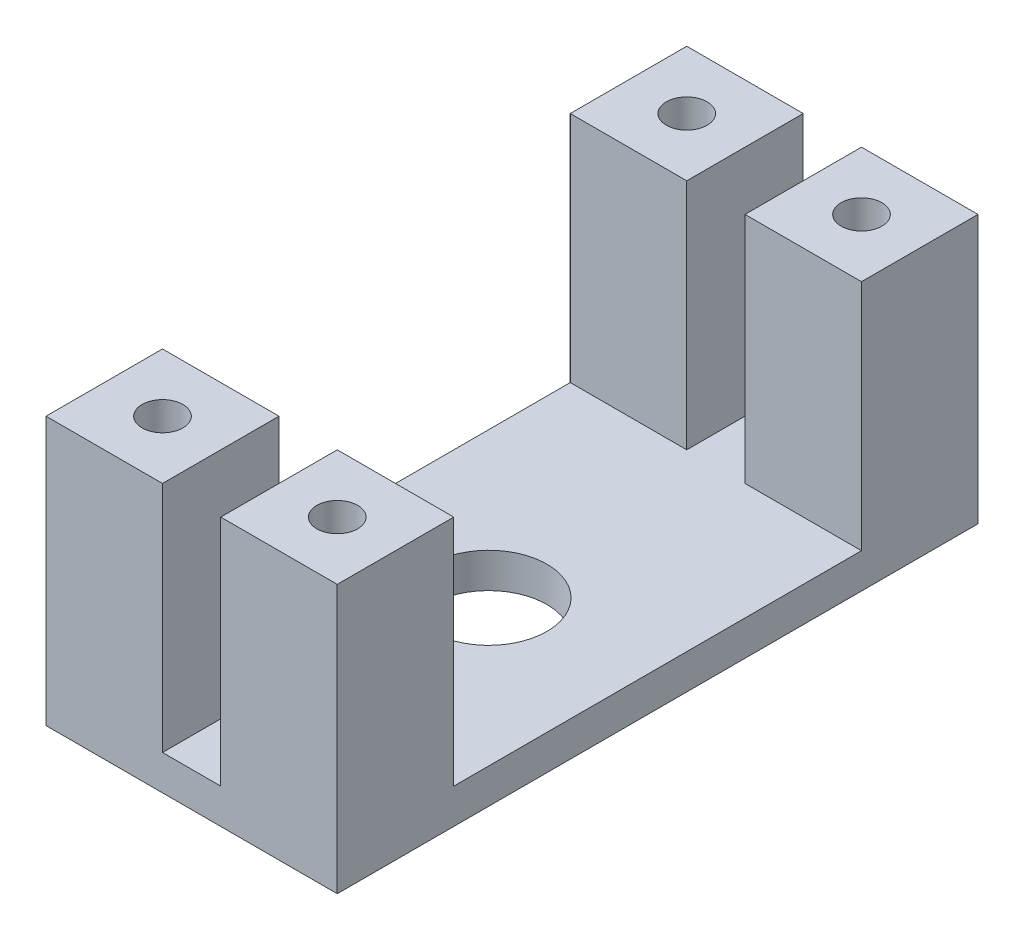
ISO-10303-21;
HEADER;
FILE_DESCRIPTION(('STEP AP214'),'2;1');
FILE_NAME('part.step','',(''),(''),'','','');
FILE_SCHEMA(('AUTOMOTIVE_DESIGN { 1 0 10303 214 1 1 1 1 }'));
ENDSEC;
DATA;
#1=APPLICATION_CONTEXT('core data for automotive mechanical design processes');
#2=APPLICATION_PROTOCOL_DEFINITION('international standard','automotive_design',2000,#1);
#3=PRODUCT_CONTEXT('',#1,'mechanical');
#4=PRODUCT('Part','Part','',(#3));
#5=PRODUCT_RELATED_PRODUCT_CATEGORY('part','',(#4));
#6=PRODUCT_DEFINITION_FORMATION('','',#4);
#7=PRODUCT_DEFINITION_CONTEXT('part definition',#1,'design');
#8=PRODUCT_DEFINITION('design','',#6,#7);
#9=PRODUCT_DEFINITION_SHAPE('','',#8);
#10=(LENGTH_UNIT() NAMED_UNIT(*) SI_UNIT(.MILLI.,.METRE.));
#11=(NAMED_UNIT(*) PLANE_ANGLE_UNIT() SI_UNIT($,.RADIAN.));
#12=(NAMED_UNIT(*) SI_UNIT($,.STERADIAN.) SOLID_ANGLE_UNIT());
#13=UNCERTAINTY_MEASURE_WITH_UNIT(LENGTH_MEASURE(1.E-05),#10,'distance_accuracy_value','');
#14=(GEOMETRIC_REPRESENTATION_CONTEXT(3) GLOBAL_UNCERTAINTY_ASSIGNED_CONTEXT((#13)) GLOBAL_UNIT_ASSIGNED_CONTEXT((#10,
#11,#12)) REPRESENTATION_CONTEXT('',''));
#15=CARTESIAN_POINT('',(0.,0.,0.));
#16=DIRECTION('',(0.,0.,1.));
#17=DIRECTION('',(1.,0.,0.));
#18=AXIS2_PLACEMENT_3D('',#15,#16,#17);
#19=CARTESIAN_POINT('',(0.,23.,0.));
#20=DIRECTION('',(0.,1.,0.));
#21=DIRECTION('',(0.,0.,1.));
#22=AXIS2_PLACEMENT_3D('',#19,#20,#21);
#23=PLANE('',#22);
#24=DIRECTION('',(0.,0.,1.));
#25=VECTOR('',#24,1.);
#26=CARTESIAN_POINT('',(2.5,23.,-27.5));
#27=LINE('',#26,#25);
#28=CARTESIAN_POINT('',(2.5,23.,-27.5));
#29=VERTEX_POINT('',#28);
#30=CARTESIAN_POINT('',(2.5,23.,-17.5));
#31=VERTEX_POINT('',#30);
#32=EDGE_CURVE('E227',#29,#31,#27,.T.);
#33=ORIENTED_EDGE('',*,*,#32,.T.);
#34=DIRECTION('',(1.,0.,0.));
#35=VECTOR('',#34,1.);
#36=CARTESIAN_POINT('',(2.5,23.,-17.5));
#37=LINE('',#36,#35);
#38=CARTESIAN_POINT('',(12.5,23.,-17.5));
#39=VERTEX_POINT('',#38);
#40=EDGE_CURVE('E235',#31,#39,#37,.T.);
#41=ORIENTED_EDGE('',*,*,#40,.T.);
#42=DIRECTION('',(0.,0.,-1.));
#43=VECTOR('',#42,1.);
#44=CARTESIAN_POINT('',(12.5,23.,-27.5));
#45=LINE('',#44,#43);
#46=CARTESIAN_POINT('',(12.5,23.,-27.5));
#47=VERTEX_POINT('',#46);
#48=EDGE_CURVE('E232',#39,#47,#45,.T.);
#49=ORIENTED_EDGE('',*,*,#48,.T.);
#50=DIRECTION('',(-1.,0.,0.));
#51=VECTOR('',#50,1.);
#52=CARTESIAN_POINT('',(2.5,23.,-27.5));
#53=LINE('',#52,#51);
#54=EDGE_CURVE('E222',#47,#29,#53,.T.);
#55=ORIENTED_EDGE('',*,*,#54,.T.);
#56=EDGE_LOOP('',(#33,#41,#49,#55));
#57=FACE_BOUND('',#56,.T.);
#58=CARTESIAN_POINT('',(7.5,23.,-22.5));
#59=DIRECTION('',(0.,-1.,0.));
#60=DIRECTION('',(0.,0.,-1.));
#61=AXIS2_PLACEMENT_3D('',#58,#59,#60);
#62=CIRCLE('',#61,1.75000000000001);
#63=CARTESIAN_POINT('',(7.5,23.,-24.25));
#64=VERTEX_POINT('',#63);
#65=EDGE_CURVE('E408',#64,#64,#62,.T.);
#66=ORIENTED_EDGE('',*,*,#65,.T.);
#67=EDGE_LOOP('',(#66));
#68=FACE_BOUND('',#67,.T.);
#69=ADVANCED_FACE('F38',(#57,#68),#23,.T.);
#70=CARTESIAN_POINT('',(0.,3.,0.));
#71=DIRECTION('',(0.,1.,0.));
#72=DIRECTION('',(0.,0.,1.));
#73=AXIS2_PLACEMENT_3D('',#70,#71,#72);
#74=PLANE('',#73);
#75=CARTESIAN_POINT('',(0.,3.,2.));
#76=DIRECTION('',(0.,1.,0.));
#77=DIRECTION('',(0.,0.,1.));
#78=AXIS2_PLACEMENT_3D('',#75,#76,#77);
#79=CIRCLE('',#78,5.00000000000001);
#80=CARTESIAN_POINT('',(0.,3.,7.00000000000001));
#81=VERTEX_POINT('',#80);
#82=EDGE_CURVE('E177',#81,#81,#79,.T.);
#83=ORIENTED_EDGE('',*,*,#82,.F.);
#84=EDGE_LOOP('',(#83));
#85=FACE_BOUND('',#84,.T.);
#86=DIRECTION('',(-1.,0.,0.));
#87=VECTOR('',#86,1.);
#88=CARTESIAN_POINT('',(-12.5,3.,17.5));
#89=LINE('',#88,#87);
#90=CARTESIAN_POINT('',(-2.49999999999999,3.,17.5));
#91=VERTEX_POINT('',#90);
#92=CARTESIAN_POINT('',(-12.5,3.,17.5));
#93=VERTEX_POINT('',#92);
#94=EDGE_CURVE('E53',#91,#93,#89,.T.);
#95=ORIENTED_EDGE('',*,*,#94,.F.);
#96=DIRECTION('',(0.,0.,-1.));
#97=VECTOR('',#96,1.);
#98=CARTESIAN_POINT('',(-2.49999999999999,3.,27.5));
#99=LINE('',#98,#97);
#100=CARTESIAN_POINT('',(-2.49999999999999,3.,27.5));
#101=VERTEX_POINT('',#100);
#102=EDGE_CURVE('E162',#101,#91,#99,.T.);
#103=ORIENTED_EDGE('',*,*,#102,.F.);
#104=DIRECTION('',(1.,0.,0.));
#105=VECTOR('',#104,1.);
#106=CARTESIAN_POINT('',(-12.5,3.,27.5));
#107=LINE('',#106,#105);
#108=CARTESIAN_POINT('',(2.50000000000001,3.,27.5));
#109=VERTEX_POINT('',#108);
#110=EDGE_CURVE('E150',#101,#109,#107,.T.);
#111=ORIENTED_EDGE('',*,*,#110,.T.);
#112=DIRECTION('',(0.,0.,1.));
#113=VECTOR('',#112,1.);
#114=CARTESIAN_POINT('',(2.50000000000001,3.,27.5));
#115=LINE('',#114,#113);
#116=CARTESIAN_POINT('',(2.50000000000001,3.,17.5));
#117=VERTEX_POINT('',#116);
#118=EDGE_CURVE('E199',#117,#109,#115,.T.);
#119=ORIENTED_EDGE('',*,*,#118,.F.);
#120=DIRECTION('',(-1.,0.,0.));
#121=VECTOR('',#120,1.);
#122=CARTESIAN_POINT('',(12.5,3.,17.5));
#123=LINE('',#122,#121);
#124=CARTESIAN_POINT('',(12.5,3.,17.5));
#125=VERTEX_POINT('',#124);
#126=EDGE_CURVE('E201',#125,#117,#123,.T.);
#127=ORIENTED_EDGE('',*,*,#126,.F.);
#128=DIRECTION('',(0.,0.,-1.));
#129=VECTOR('',#128,1.);
#130=CARTESIAN_POINT('',(12.5,3.,-27.5));
#131=LINE('',#130,#129);
#132=CARTESIAN_POINT('',(12.5,3.,-17.5));
#133=VERTEX_POINT('',#132);
#134=EDGE_CURVE('E264',#125,#133,#131,.T.);
#135=ORIENTED_EDGE('',*,*,#134,.T.);
#136=DIRECTION('',(1.,0.,0.));
#137=VECTOR('',#136,1.);
#138=CARTESIAN_POINT('',(2.5,3.,-17.5));
#139=LINE('',#138,#137);
#140=CARTESIAN_POINT('',(2.5,3.,-17.5));
#141=VERTEX_POINT('',#140);
#142=EDGE_CURVE('E223',#141,#133,#139,.T.);
#143=ORIENTED_EDGE('',*,*,#142,.F.);
#144=DIRECTION('',(0.,0.,1.));
#145=VECTOR('',#144,1.);
#146=CARTESIAN_POINT('',(2.5,3.,-27.5));
#147=LINE('',#146,#145);
#148=CARTESIAN_POINT('',(2.5,3.,-27.5));
#149=VERTEX_POINT('',#148);
#150=EDGE_CURVE('E226',#149,#141,#147,.T.);
#151=ORIENTED_EDGE('',*,*,#150,.F.);
#152=DIRECTION('',(-1.,0.,0.));
#153=VECTOR('',#152,1.);
#154=CARTESIAN_POINT('',(-12.5,3.,-27.5));
#155=LINE('',#154,#153);
#156=CARTESIAN_POINT('',(-2.5,3.,-27.5));
#157=VERTEX_POINT('',#156);
#158=EDGE_CURVE('E266',#149,#157,#155,.T.);
#159=ORIENTED_EDGE('',*,*,#158,.T.);
#160=DIRECTION('',(0.,0.,-1.));
#161=VECTOR('',#160,1.);
#162=CARTESIAN_POINT('',(-2.5,3.,-27.5));
#163=LINE('',#162,#161);
#164=CARTESIAN_POINT('',(-2.5,3.,-17.5));
#165=VERTEX_POINT('',#164);
#166=EDGE_CURVE('E243',#165,#157,#163,.T.);
#167=ORIENTED_EDGE('',*,*,#166,.F.);
#168=DIRECTION('',(1.,0.,0.));
#169=VECTOR('',#168,1.);
#170=CARTESIAN_POINT('',(-12.5,3.,-17.5));
#171=LINE('',#170,#169);
#172=CARTESIAN_POINT('',(-12.5,3.,-17.5));
#173=VERTEX_POINT('',#172);
#174=EDGE_CURVE('E230',#173,#165,#171,.T.);
#175=ORIENTED_EDGE('',*,*,#174,.F.);
#176=DIRECTION('',(0.,0.,1.));
#177=VECTOR('',#176,1.);
#178=CARTESIAN_POINT('',(-12.5,3.,-27.5));
#179=LINE('',#178,#177);
#180=EDGE_CURVE('E58',#173,#93,#179,.T.);
#181=ORIENTED_EDGE('',*,*,#180,.T.);
#182=EDGE_LOOP('',(#95,#103,#111,#119,#127,#135,#143,#151,#159,#167,#175,#181));
#183=FACE_BOUND('',#182,.T.);
#184=ADVANCED_FACE('F163',(#85,#183),#74,.T.);
#185=CARTESIAN_POINT('',(12.5,3.,-27.5));
#186=DIRECTION('',(-1.,0.,0.));
#187=DIRECTION('',(0.,0.,1.));
#188=AXIS2_PLACEMENT_3D('',#185,#186,#187);
#189=PLANE('',#188);
#190=DIRECTION('',(0.,0.,-1.));
#191=VECTOR('',#190,1.);
#192=CARTESIAN_POINT('',(12.5,0.,-27.5));
#193=LINE('',#192,#191);
#194=CARTESIAN_POINT('',(12.5,0.,27.5));
#195=VERTEX_POINT('',#194);
#196=CARTESIAN_POINT('',(12.5,0.,-27.5));
#197=VERTEX_POINT('',#196);
#198=EDGE_CURVE('E263',#195,#197,#193,.T.);
#199=ORIENTED_EDGE('',*,*,#198,.T.);
#200=DIRECTION('',(0.,-1.,0.));
#201=VECTOR('',#200,1.);
#202=CARTESIAN_POINT('',(12.5,3.,-27.5));
#203=LINE('',#202,#201);
#204=EDGE_CURVE('E11',#47,#197,#203,.T.);
#205=ORIENTED_EDGE('',*,*,#204,.F.);
#206=ORIENTED_EDGE('',*,*,#48,.F.);
#207=DIRECTION('',(0.,-1.,0.));
#208=VECTOR('',#207,1.);
#209=CARTESIAN_POINT('',(12.5,23.,-17.5));
#210=LINE('',#209,#208);
#211=EDGE_CURVE('E216',#39,#133,#210,.T.);
#212=ORIENTED_EDGE('',*,*,#211,.T.);
#213=ORIENTED_EDGE('',*,*,#134,.F.);
#214=DIRECTION('',(0.,-1.,0.));
#215=VECTOR('',#214,1.);
#216=CARTESIAN_POINT('',(12.5,23.,17.5));
#217=LINE('',#216,#215);
#218=CARTESIAN_POINT('',(12.5,23.,17.5));
#219=VERTEX_POINT('',#218);
#220=EDGE_CURVE('E167',#219,#125,#217,.T.);
#221=ORIENTED_EDGE('',*,*,#220,.F.);
#222=DIRECTION('',(0.,0.,-1.));
#223=VECTOR('',#222,1.);
#224=CARTESIAN_POINT('',(12.5,23.,27.5));
#225=LINE('',#224,#223);
#226=CARTESIAN_POINT('',(12.5,23.,27.5));
#227=VERTEX_POINT('',#226);
#228=EDGE_CURVE('E202',#227,#219,#225,.T.);
#229=ORIENTED_EDGE('',*,*,#228,.F.);
#230=DIRECTION('',(0.,-1.,0.));
#231=VECTOR('',#230,1.);
#232=CARTESIAN_POINT('',(12.5,3.,27.5));
#233=LINE('',#232,#231);
#234=EDGE_CURVE('E160',#227,#195,#233,.T.);
#235=ORIENTED_EDGE('',*,*,#234,.T.);
#236=EDGE_LOOP('',(#199,#205,#206,#212,#213,#221,#229,#235));
#237=FACE_BOUND('',#236,.T.);
#238=ADVANCED_FACE('F40',(#237),#189,.F.);
#239=CARTESIAN_POINT('',(-12.5,3.,-27.5));
#240=DIRECTION('',(0.,0.,1.));
#241=DIRECTION('',(1.,0.,0.));
#242=AXIS2_PLACEMENT_3D('',#239,#240,#241);
#243=PLANE('',#242);
#244=DIRECTION('',(-1.,0.,0.));
#245=VECTOR('',#244,1.);
#246=CARTESIAN_POINT('',(-12.5,0.,-27.5));
#247=LINE('',#246,#245);
#248=CARTESIAN_POINT('',(-12.5,0.,-27.5));
#249=VERTEX_POINT('',#248);
#250=EDGE_CURVE('E272',#197,#249,#247,.T.);
#251=ORIENTED_EDGE('',*,*,#250,.T.);
#252=DIRECTION('',(0.,-1.,0.));
#253=VECTOR('',#252,1.);
#254=CARTESIAN_POINT('',(-12.5,3.,-27.5));
#255=LINE('',#254,#253);
#256=CARTESIAN_POINT('',(-12.5,23.,-27.5));
#257=VERTEX_POINT('',#256);
#258=EDGE_CURVE('E46',#257,#249,#255,.T.);
#259=ORIENTED_EDGE('',*,*,#258,.F.);
#260=DIRECTION('',(-1.,0.,0.));
#261=VECTOR('',#260,1.);
#262=CARTESIAN_POINT('',(-12.5,23.,-27.5));
#263=LINE('',#262,#261);
#264=CARTESIAN_POINT('',(-2.5,23.,-27.5));
#265=VERTEX_POINT('',#264);
#266=EDGE_CURVE('E247',#265,#257,#263,.T.);
#267=ORIENTED_EDGE('',*,*,#266,.F.);
#268=DIRECTION('',(0.,-1.,0.));
#269=VECTOR('',#268,1.);
#270=CARTESIAN_POINT('',(-2.5,23.,-27.5));
#271=LINE('',#270,#269);
#272=EDGE_CURVE('E250',#265,#157,#271,.T.);
#273=ORIENTED_EDGE('',*,*,#272,.T.);
#274=ORIENTED_EDGE('',*,*,#158,.F.);
#275=DIRECTION('',(0.,-1.,0.));
#276=VECTOR('',#275,1.);
#277=CARTESIAN_POINT('',(2.5,23.,-27.5));
#278=LINE('',#277,#276);
#279=EDGE_CURVE('E219',#29,#149,#278,.T.);
#280=ORIENTED_EDGE('',*,*,#279,.F.);
#281=ORIENTED_EDGE('',*,*,#54,.F.);
#282=ORIENTED_EDGE('',*,*,#204,.T.);
#283=EDGE_LOOP('',(#251,#259,#267,#273,#274,#280,#281,#282));
#284=FACE_BOUND('',#283,.T.);
#285=ADVANCED_FACE('F346',(#284),#243,.F.);
#286=CARTESIAN_POINT('',(-12.5,3.,-27.5));
#287=DIRECTION('',(1.,0.,0.));
#288=DIRECTION('',(0.,0.,-1.));
#289=AXIS2_PLACEMENT_3D('',#286,#287,#288);
#290=PLANE('',#289);
#291=DIRECTION('',(0.,0.,1.));
#292=VECTOR('',#291,1.);
#293=CARTESIAN_POINT('',(-12.5,0.,-27.5));
#294=LINE('',#293,#292);
#295=CARTESIAN_POINT('',(-12.5,0.,27.5));
#296=VERTEX_POINT('',#295);
#297=EDGE_CURVE('E274',#249,#296,#294,.T.);
#298=ORIENTED_EDGE('',*,*,#297,.T.);
#299=DIRECTION('',(0.,-1.,0.));
#300=VECTOR('',#299,1.);
#301=CARTESIAN_POINT('',(-12.5,3.,27.5));
#302=LINE('',#301,#300);
#303=CARTESIAN_POINT('',(-12.5,23.,27.5));
#304=VERTEX_POINT('',#303);
#305=EDGE_CURVE('E279',#304,#296,#302,.T.);
#306=ORIENTED_EDGE('',*,*,#305,.F.);
#307=DIRECTION('',(0.,0.,1.));
#308=VECTOR('',#307,1.);
#309=CARTESIAN_POINT('',(-12.5,23.,27.5));
#310=LINE('',#309,#308);
#311=CARTESIAN_POINT('',(-12.5,23.,17.5));
#312=VERTEX_POINT('',#311);
#313=EDGE_CURVE('E184',#312,#304,#310,.T.);
#314=ORIENTED_EDGE('',*,*,#313,.F.);
#315=DIRECTION('',(0.,-1.,0.));
#316=VECTOR('',#315,1.);
#317=CARTESIAN_POINT('',(-12.5,23.,17.5));
#318=LINE('',#317,#316);
#319=EDGE_CURVE('E174',#312,#93,#318,.T.);
#320=ORIENTED_EDGE('',*,*,#319,.T.);
#321=ORIENTED_EDGE('',*,*,#180,.F.);
#322=DIRECTION('',(0.,-1.,0.));
#323=VECTOR('',#322,1.);
#324=CARTESIAN_POINT('',(-12.5,23.,-17.5));
#325=LINE('',#324,#323);
#326=CARTESIAN_POINT('',(-12.5,23.,-17.5));
#327=VERTEX_POINT('',#326);
#328=EDGE_CURVE('E260',#327,#173,#325,.T.);
#329=ORIENTED_EDGE('',*,*,#328,.F.);
#330=DIRECTION('',(0.,0.,1.));
#331=VECTOR('',#330,1.);
#332=CARTESIAN_POINT('',(-12.5,23.,-27.5));
#333=LINE('',#332,#331);
#334=EDGE_CURVE('E239',#257,#327,#333,.T.);
#335=ORIENTED_EDGE('',*,*,#334,.F.);
#336=ORIENTED_EDGE('',*,*,#258,.T.);
#337=EDGE_LOOP('',(#298,#306,#314,#320,#321,#329,#335,#336));
#338=FACE_BOUND('',#337,.T.);
#339=ADVANCED_FACE('F285',(#338),#290,.F.);
#340=CARTESIAN_POINT('',(-12.5,3.,27.5));
#341=DIRECTION('',(0.,0.,-1.));
#342=DIRECTION('',(-1.,0.,0.));
#343=AXIS2_PLACEMENT_3D('',#340,#341,#342);
#344=PLANE('',#343);
#345=DIRECTION('',(1.,0.,0.));
#346=VECTOR('',#345,1.);
#347=CARTESIAN_POINT('',(-12.5,0.,27.5));
#348=LINE('',#347,#346);
#349=EDGE_CURVE('E267',#296,#195,#348,.T.);
#350=ORIENTED_EDGE('',*,*,#349,.T.);
#351=ORIENTED_EDGE('',*,*,#234,.F.);
#352=DIRECTION('',(1.,0.,0.));
#353=VECTOR('',#352,1.);
#354=CARTESIAN_POINT('',(12.5,23.,27.5));
#355=LINE('',#354,#353);
#356=CARTESIAN_POINT('',(2.50000000000001,23.,27.5));
#357=VERTEX_POINT('',#356);
#358=EDGE_CURVE('E198',#357,#227,#355,.T.);
#359=ORIENTED_EDGE('',*,*,#358,.F.);
#360=DIRECTION('',(0.,-1.,0.));
#361=VECTOR('',#360,1.);
#362=CARTESIAN_POINT('',(2.50000000000001,23.,27.5));
#363=LINE('',#362,#361);
#364=EDGE_CURVE('E158',#357,#109,#363,.T.);
#365=ORIENTED_EDGE('',*,*,#364,.T.);
#366=ORIENTED_EDGE('',*,*,#110,.F.);
#367=DIRECTION('',(0.,-1.,0.));
#368=VECTOR('',#367,1.);
#369=CARTESIAN_POINT('',(-2.49999999999999,23.,27.5));
#370=LINE('',#369,#368);
#371=CARTESIAN_POINT('',(-2.49999999999999,23.,27.5));
#372=VERTEX_POINT('',#371);
#373=EDGE_CURVE('E154',#372,#101,#370,.T.);
#374=ORIENTED_EDGE('',*,*,#373,.F.);
#375=DIRECTION('',(1.,0.,0.));
#376=VECTOR('',#375,1.);
#377=CARTESIAN_POINT('',(-12.5,23.,27.5));
#378=LINE('',#377,#376);
#379=EDGE_CURVE('E188',#304,#372,#378,.T.);
#380=ORIENTED_EDGE('',*,*,#379,.F.);
#381=ORIENTED_EDGE('',*,*,#305,.T.);
#382=EDGE_LOOP('',(#350,#351,#359,#365,#366,#374,#380,#381));
#383=FACE_BOUND('',#382,.T.);
#384=ADVANCED_FACE('F151',(#383),#344,.F.);
#385=CARTESIAN_POINT('',(0.,0.,0.));
#386=DIRECTION('',(0.,1.,0.));
#387=DIRECTION('',(0.,0.,1.));
#388=AXIS2_PLACEMENT_3D('',#385,#386,#387);
#389=PLANE('',#388);
#390=CARTESIAN_POINT('',(-7.5,0.,-22.5));
#391=DIRECTION('',(0.,1.,0.));
#392=DIRECTION('',(0.,0.,1.));
#393=AXIS2_PLACEMENT_3D('',#390,#391,#392);
#394=CIRCLE('',#393,1.75000000000001);
#395=CARTESIAN_POINT('',(-7.5,0.,-20.75));
#396=VERTEX_POINT('',#395);
#397=EDGE_CURVE('E404',#396,#396,#394,.T.);
#398=ORIENTED_EDGE('',*,*,#397,.T.);
#399=EDGE_LOOP('',(#398));
#400=FACE_BOUND('',#399,.T.);
#401=CARTESIAN_POINT('',(7.5,0.,-22.5));
#402=DIRECTION('',(0.,1.,0.));
#403=DIRECTION('',(0.,0.,1.));
#404=AXIS2_PLACEMENT_3D('',#401,#402,#403);
#405=CIRCLE('',#404,1.75000000000001);
#406=CARTESIAN_POINT('',(7.5,0.,-20.75));
#407=VERTEX_POINT('',#406);
#408=EDGE_CURVE('E419',#407,#407,#405,.T.);
#409=ORIENTED_EDGE('',*,*,#408,.T.);
#410=EDGE_LOOP('',(#409));
#411=FACE_BOUND('',#410,.T.);
#412=CARTESIAN_POINT('',(7.50000000000001,0.,22.5));
#413=DIRECTION('',(0.,1.,0.));
#414=DIRECTION('',(0.,0.,1.));
#415=AXIS2_PLACEMENT_3D('',#412,#413,#414);
#416=CIRCLE('',#415,1.75000000000001);
#417=CARTESIAN_POINT('',(7.50000000000001,0.,24.25));
#418=VERTEX_POINT('',#417);
#419=EDGE_CURVE('E422',#418,#418,#416,.T.);
#420=ORIENTED_EDGE('',*,*,#419,.T.);
#421=EDGE_LOOP('',(#420));
#422=FACE_BOUND('',#421,.T.);
#423=CARTESIAN_POINT('',(-7.49999999999999,0.,22.5));
#424=DIRECTION('',(0.,1.,0.));
#425=DIRECTION('',(0.,0.,1.));
#426=AXIS2_PLACEMENT_3D('',#423,#424,#425);
#427=CIRCLE('',#426,1.75000000000001);
#428=CARTESIAN_POINT('',(-7.49999999999999,0.,24.25));
#429=VERTEX_POINT('',#428);
#430=EDGE_CURVE('E425',#429,#429,#427,.T.);
#431=ORIENTED_EDGE('',*,*,#430,.T.);
#432=EDGE_LOOP('',(#431));
#433=FACE_BOUND('',#432,.T.);
#434=CARTESIAN_POINT('',(0.,0.,2.));
#435=DIRECTION('',(0.,1.,0.));
#436=DIRECTION('',(0.,0.,1.));
#437=AXIS2_PLACEMENT_3D('',#434,#435,#436);
#438=CIRCLE('',#437,5.00000000000001);
#439=CARTESIAN_POINT('',(0.,0.,7.00000000000001));
#440=VERTEX_POINT('',#439);
#441=EDGE_CURVE('E172',#440,#440,#438,.T.);
#442=ORIENTED_EDGE('',*,*,#441,.T.);
#443=EDGE_LOOP('',(#442));
#444=FACE_BOUND('',#443,.T.);
#445=ORIENTED_EDGE('',*,*,#198,.F.);
#446=ORIENTED_EDGE('',*,*,#349,.F.);
#447=ORIENTED_EDGE('',*,*,#297,.F.);
#448=ORIENTED_EDGE('',*,*,#250,.F.);
#449=EDGE_LOOP('',(#445,#446,#447,#448));
#450=FACE_BOUND('',#449,.T.);
#451=ADVANCED_FACE('F292',(#400,#411,#422,#433,#444,#450),#389,.F.);
#452=CARTESIAN_POINT('',(-12.5,23.,-17.5));
#453=DIRECTION('',(0.,0.,-1.));
#454=DIRECTION('',(-1.,0.,0.));
#455=AXIS2_PLACEMENT_3D('',#452,#453,#454);
#456=PLANE('',#455);
#457=ORIENTED_EDGE('',*,*,#174,.T.);
#458=DIRECTION('',(0.,-1.,0.));
#459=VECTOR('',#458,1.);
#460=CARTESIAN_POINT('',(-2.5,23.,-17.5));
#461=LINE('',#460,#459);
#462=CARTESIAN_POINT('',(-2.5,23.,-17.5));
#463=VERTEX_POINT('',#462);
#464=EDGE_CURVE('E257',#463,#165,#461,.T.);
#465=ORIENTED_EDGE('',*,*,#464,.F.);
#466=DIRECTION('',(1.,0.,0.));
#467=VECTOR('',#466,1.);
#468=CARTESIAN_POINT('',(-12.5,23.,-17.5));
#469=LINE('',#468,#467);
#470=EDGE_CURVE('E242',#327,#463,#469,.T.);
#471=ORIENTED_EDGE('',*,*,#470,.F.);
#472=ORIENTED_EDGE('',*,*,#328,.T.);
#473=EDGE_LOOP('',(#457,#465,#471,#472));
#474=FACE_BOUND('',#473,.T.);
#475=ADVANCED_FACE('F336',(#474),#456,.F.);
#476=CARTESIAN_POINT('',(-2.5,23.,-27.5));
#477=DIRECTION('',(-1.,0.,0.));
#478=DIRECTION('',(0.,0.,1.));
#479=AXIS2_PLACEMENT_3D('',#476,#477,#478);
#480=PLANE('',#479);
#481=ORIENTED_EDGE('',*,*,#166,.T.);
#482=ORIENTED_EDGE('',*,*,#272,.F.);
#483=DIRECTION('',(0.,0.,-1.));
#484=VECTOR('',#483,1.);
#485=CARTESIAN_POINT('',(-2.5,23.,-27.5));
#486=LINE('',#485,#484);
#487=EDGE_CURVE('E245',#463,#265,#486,.T.);
#488=ORIENTED_EDGE('',*,*,#487,.F.);
#489=ORIENTED_EDGE('',*,*,#464,.T.);
#490=EDGE_LOOP('',(#481,#482,#488,#489));
#491=FACE_BOUND('',#490,.T.);
#492=ADVANCED_FACE('F332',(#491),#480,.F.);
#493=CARTESIAN_POINT('',(0.,23.,0.));
#494=DIRECTION('',(0.,1.,0.));
#495=DIRECTION('',(0.,0.,1.));
#496=AXIS2_PLACEMENT_3D('',#493,#494,#495);
#497=PLANE('',#496);
#498=CARTESIAN_POINT('',(-7.5,23.,-22.5));
#499=DIRECTION('',(0.,-1.,0.));
#500=DIRECTION('',(0.,0.,-1.));
#501=AXIS2_PLACEMENT_3D('',#498,#499,#500);
#502=CIRCLE('',#501,1.75000000000001);
#503=CARTESIAN_POINT('',(-7.5,23.,-24.25));
#504=VERTEX_POINT('',#503);
#505=EDGE_CURVE('E407',#504,#504,#502,.T.);
#506=ORIENTED_EDGE('',*,*,#505,.T.);
#507=EDGE_LOOP('',(#506));
#508=FACE_BOUND('',#507,.T.);
#509=ORIENTED_EDGE('',*,*,#334,.T.);
#510=ORIENTED_EDGE('',*,*,#470,.T.);
#511=ORIENTED_EDGE('',*,*,#487,.T.);
#512=ORIENTED_EDGE('',*,*,#266,.T.);
#513=EDGE_LOOP('',(#509,#510,#511,#512));
#514=FACE_BOUND('',#513,.T.);
#515=ADVANCED_FACE('F330',(#508,#514),#497,.T.);
#516=CARTESIAN_POINT('',(2.5,23.,-27.5));
#517=DIRECTION('',(1.,0.,0.));
#518=DIRECTION('',(0.,0.,-1.));
#519=AXIS2_PLACEMENT_3D('',#516,#517,#518);
#520=PLANE('',#519);
#521=ORIENTED_EDGE('',*,*,#150,.T.);
#522=DIRECTION('',(0.,-1.,0.));
#523=VECTOR('',#522,1.);
#524=CARTESIAN_POINT('',(2.5,23.,-17.5));
#525=LINE('',#524,#523);
#526=EDGE_CURVE('E205',#31,#141,#525,.T.);
#527=ORIENTED_EDGE('',*,*,#526,.F.);
#528=ORIENTED_EDGE('',*,*,#32,.F.);
#529=ORIENTED_EDGE('',*,*,#279,.T.);
#530=EDGE_LOOP('',(#521,#527,#528,#529));
#531=FACE_BOUND('',#530,.T.);
#532=ADVANCED_FACE('F313',(#531),#520,.F.);
#533=CARTESIAN_POINT('',(2.5,23.,-17.5));
#534=DIRECTION('',(0.,0.,-1.));
#535=DIRECTION('',(-1.,0.,0.));
#536=AXIS2_PLACEMENT_3D('',#533,#534,#535);
#537=PLANE('',#536);
#538=ORIENTED_EDGE('',*,*,#142,.T.);
#539=ORIENTED_EDGE('',*,*,#211,.F.);
#540=ORIENTED_EDGE('',*,*,#40,.F.);
#541=ORIENTED_EDGE('',*,*,#526,.T.);
#542=EDGE_LOOP('',(#538,#539,#540,#541));
#543=FACE_BOUND('',#542,.T.);
#544=ADVANCED_FACE('F306',(#543),#537,.F.);
#545=CARTESIAN_POINT('',(12.5,23.,17.5));
#546=DIRECTION('',(0.,0.,1.));
#547=DIRECTION('',(1.,0.,0.));
#548=AXIS2_PLACEMENT_3D('',#545,#546,#547);
#549=PLANE('',#548);
#550=ORIENTED_EDGE('',*,*,#126,.T.);
#551=DIRECTION('',(0.,-1.,0.));
#552=VECTOR('',#551,1.);
#553=CARTESIAN_POINT('',(2.50000000000001,23.,17.5));
#554=LINE('',#553,#552);
#555=CARTESIAN_POINT('',(2.50000000000001,23.,17.5));
#556=VERTEX_POINT('',#555);
#557=EDGE_CURVE('E194',#556,#117,#554,.T.);
#558=ORIENTED_EDGE('',*,*,#557,.F.);
#559=DIRECTION('',(-1.,0.,0.));
#560=VECTOR('',#559,1.);
#561=CARTESIAN_POINT('',(12.5,23.,17.5));
#562=LINE('',#561,#560);
#563=EDGE_CURVE('E210',#219,#556,#562,.T.);
#564=ORIENTED_EDGE('',*,*,#563,.F.);
#565=ORIENTED_EDGE('',*,*,#220,.T.);
#566=EDGE_LOOP('',(#550,#558,#564,#565));
#567=FACE_BOUND('',#566,.T.);
#568=ADVANCED_FACE('F304',(#567),#549,.F.);
#569=CARTESIAN_POINT('',(2.50000000000001,23.,27.5));
#570=DIRECTION('',(1.,0.,0.));
#571=DIRECTION('',(0.,0.,-1.));
#572=AXIS2_PLACEMENT_3D('',#569,#570,#571);
#573=PLANE('',#572);
#574=ORIENTED_EDGE('',*,*,#118,.T.);
#575=ORIENTED_EDGE('',*,*,#364,.F.);
#576=DIRECTION('',(0.,0.,1.));
#577=VECTOR('',#576,1.);
#578=CARTESIAN_POINT('',(2.50000000000001,23.,27.5));
#579=LINE('',#578,#577);
#580=EDGE_CURVE('E208',#556,#357,#579,.T.);
#581=ORIENTED_EDGE('',*,*,#580,.F.);
#582=ORIENTED_EDGE('',*,*,#557,.T.);
#583=EDGE_LOOP('',(#574,#575,#581,#582));
#584=FACE_BOUND('',#583,.T.);
#585=ADVANCED_FACE('F302',(#584),#573,.F.);
#586=CARTESIAN_POINT('',(0.,23.,0.));
#587=DIRECTION('',(0.,1.,0.));
#588=DIRECTION('',(0.,0.,1.));
#589=AXIS2_PLACEMENT_3D('',#586,#587,#588);
#590=PLANE('',#589);
#591=CARTESIAN_POINT('',(7.50000000000001,23.,22.5));
#592=DIRECTION('',(0.,-1.,0.));
#593=DIRECTION('',(0.,0.,-1.));
#594=AXIS2_PLACEMENT_3D('',#591,#592,#593);
#595=CIRCLE('',#594,1.75000000000001);
#596=CARTESIAN_POINT('',(7.50000000000001,23.,20.75));
#597=VERTEX_POINT('',#596);
#598=EDGE_CURVE('E411',#597,#597,#595,.T.);
#599=ORIENTED_EDGE('',*,*,#598,.T.);
#600=EDGE_LOOP('',(#599));
#601=FACE_BOUND('',#600,.T.);
#602=ORIENTED_EDGE('',*,*,#228,.T.);
#603=ORIENTED_EDGE('',*,*,#563,.T.);
#604=ORIENTED_EDGE('',*,*,#580,.T.);
#605=ORIENTED_EDGE('',*,*,#358,.T.);
#606=EDGE_LOOP('',(#602,#603,#604,#605));
#607=FACE_BOUND('',#606,.T.);
#608=ADVANCED_FACE('F298',(#601,#607),#590,.T.);
#609=CARTESIAN_POINT('',(-2.49999999999999,23.,27.5));
#610=DIRECTION('',(-1.,0.,0.));
#611=DIRECTION('',(0.,0.,1.));
#612=AXIS2_PLACEMENT_3D('',#609,#610,#611);
#613=PLANE('',#612);
#614=ORIENTED_EDGE('',*,*,#102,.T.);
#615=DIRECTION('',(0.,-1.,0.));
#616=VECTOR('',#615,1.);
#617=CARTESIAN_POINT('',(-2.49999999999999,23.,17.5));
#618=LINE('',#617,#616);
#619=CARTESIAN_POINT('',(-2.49999999999999,23.,17.5));
#620=VERTEX_POINT('',#619);
#621=EDGE_CURVE('E171',#620,#91,#618,.T.);
#622=ORIENTED_EDGE('',*,*,#621,.F.);
#623=DIRECTION('',(0.,0.,-1.));
#624=VECTOR('',#623,1.);
#625=CARTESIAN_POINT('',(-2.49999999999999,23.,27.5));
#626=LINE('',#625,#624);
#627=EDGE_CURVE('E170',#372,#620,#626,.T.);
#628=ORIENTED_EDGE('',*,*,#627,.F.);
#629=ORIENTED_EDGE('',*,*,#373,.T.);
#630=EDGE_LOOP('',(#614,#622,#628,#629));
#631=FACE_BOUND('',#630,.T.);
#632=ADVANCED_FACE('F169',(#631),#613,.F.);
#633=CARTESIAN_POINT('',(-12.5,23.,17.5));
#634=DIRECTION('',(0.,0.,1.));
#635=DIRECTION('',(1.,0.,0.));
#636=AXIS2_PLACEMENT_3D('',#633,#634,#635);
#637=PLANE('',#636);
#638=ORIENTED_EDGE('',*,*,#94,.T.);
#639=ORIENTED_EDGE('',*,*,#319,.F.);
#640=DIRECTION('',(-1.,0.,0.));
#641=VECTOR('',#640,1.);
#642=CARTESIAN_POINT('',(-12.5,23.,17.5));
#643=LINE('',#642,#641);
#644=EDGE_CURVE('E183',#620,#312,#643,.T.);
#645=ORIENTED_EDGE('',*,*,#644,.F.);
#646=ORIENTED_EDGE('',*,*,#621,.T.);
#647=EDGE_LOOP('',(#638,#639,#645,#646));
#648=FACE_BOUND('',#647,.T.);
#649=ADVANCED_FACE('F366',(#648),#637,.F.);
#650=CARTESIAN_POINT('',(0.,23.,0.));
#651=DIRECTION('',(0.,-1.,0.));
#652=DIRECTION('',(0.,0.,-1.));
#653=AXIS2_PLACEMENT_3D('',#650,#651,#652);
#654=PLANE('',#653);
#655=CARTESIAN_POINT('',(-7.49999999999999,23.,22.5));
#656=DIRECTION('',(0.,-1.,0.));
#657=DIRECTION('',(0.,0.,-1.));
#658=AXIS2_PLACEMENT_3D('',#655,#656,#657);
#659=CIRCLE('',#658,1.75000000000001);
#660=CARTESIAN_POINT('',(-7.49999999999999,23.,20.75));
#661=VERTEX_POINT('',#660);
#662=EDGE_CURVE('E416',#661,#661,#659,.T.);
#663=ORIENTED_EDGE('',*,*,#662,.T.);
#664=EDGE_LOOP('',(#663));
#665=FACE_BOUND('',#664,.T.);
#666=ORIENTED_EDGE('',*,*,#313,.T.);
#667=ORIENTED_EDGE('',*,*,#379,.T.);
#668=ORIENTED_EDGE('',*,*,#627,.T.);
#669=ORIENTED_EDGE('',*,*,#644,.T.);
#670=EDGE_LOOP('',(#666,#667,#668,#669));
#671=FACE_BOUND('',#670,.T.);
#672=ADVANCED_FACE('F368',(#665,#671),#654,.F.);
#673=CARTESIAN_POINT('',(0.,3.,2.));
#674=DIRECTION('',(0.,1.,0.));
#675=DIRECTION('',(0.,0.,1.));
#676=AXIS2_PLACEMENT_3D('',#673,#674,#675);
#677=CYLINDRICAL_SURFACE('',#676,5.00000000000001);
#678=ORIENTED_EDGE('',*,*,#441,.F.);
#679=EDGE_LOOP('',(#678));
#680=FACE_BOUND('',#679,.T.);
#681=ORIENTED_EDGE('',*,*,#82,.T.);
#682=EDGE_LOOP('',(#681));
#683=FACE_BOUND('',#682,.T.);
#684=ADVANCED_FACE('F370',(#680,#683),#677,.F.);
#685=CARTESIAN_POINT('',(-7.49999999999999,3.,22.5));
#686=DIRECTION('',(0.,1.,0.));
#687=DIRECTION('',(0.,0.,1.));
#688=AXIS2_PLACEMENT_3D('',#685,#686,#687);
#689=CYLINDRICAL_SURFACE('',#688,1.75000000000001);
#690=ORIENTED_EDGE('',*,*,#430,.F.);
#691=EDGE_LOOP('',(#690));
#692=FACE_BOUND('',#691,.T.);
#693=ORIENTED_EDGE('',*,*,#662,.F.);
#694=EDGE_LOOP('',(#693));
#695=FACE_BOUND('',#694,.T.);
#696=ADVANCED_FACE('F377',(#692,#695),#689,.F.);
#697=CARTESIAN_POINT('',(7.50000000000001,3.,22.5));
#698=DIRECTION('',(0.,1.,0.));
#699=DIRECTION('',(0.,0.,1.));
#700=AXIS2_PLACEMENT_3D('',#697,#698,#699);
#701=CYLINDRICAL_SURFACE('',#700,1.75000000000001);
#702=ORIENTED_EDGE('',*,*,#419,.F.);
#703=EDGE_LOOP('',(#702));
#704=FACE_BOUND('',#703,.T.);
#705=ORIENTED_EDGE('',*,*,#598,.F.);
#706=EDGE_LOOP('',(#705));
#707=FACE_BOUND('',#706,.T.);
#708=ADVANCED_FACE('F387',(#704,#707),#701,.F.);
#709=CARTESIAN_POINT('',(7.5,3.,-22.5));
#710=DIRECTION('',(0.,1.,0.));
#711=DIRECTION('',(0.,0.,1.));
#712=AXIS2_PLACEMENT_3D('',#709,#710,#711);
#713=CYLINDRICAL_SURFACE('',#712,1.75000000000001);
#714=ORIENTED_EDGE('',*,*,#408,.F.);
#715=EDGE_LOOP('',(#714));
#716=FACE_BOUND('',#715,.T.);
#717=ORIENTED_EDGE('',*,*,#65,.F.);
#718=EDGE_LOOP('',(#717));
#719=FACE_BOUND('',#718,.T.);
#720=ADVANCED_FACE('F391',(#716,#719),#713,.F.);
#721=CARTESIAN_POINT('',(-7.5,3.,-22.5));
#722=DIRECTION('',(0.,1.,0.));
#723=DIRECTION('',(0.,0.,1.));
#724=AXIS2_PLACEMENT_3D('',#721,#722,#723);
#725=CYLINDRICAL_SURFACE('',#724,1.75000000000001);
#726=ORIENTED_EDGE('',*,*,#397,.F.);
#727=EDGE_LOOP('',(#726));
#728=FACE_BOUND('',#727,.T.);
#729=ORIENTED_EDGE('',*,*,#505,.F.);
#730=EDGE_LOOP('',(#729));
#731=FACE_BOUND('',#730,.T.);
#732=ADVANCED_FACE('F395',(#728,#731),#725,.F.);
#733=CLOSED_SHELL('',(#69,#184,#238,#285,#339,#384,#451,#475,#492,#515,#532,#544,#568,#585,#608,
#632,#649,#672,#684,#696,#708,#720,#732));
#734=MANIFOLD_SOLID_BREP('B2',#733);
#735=ADVANCED_BREP_SHAPE_REPRESENTATION('',(#18,#734),#14);
#736=SHAPE_DEFINITION_REPRESENTATION(#9,#735);
ENDSEC;
END-ISO-10303-21;
